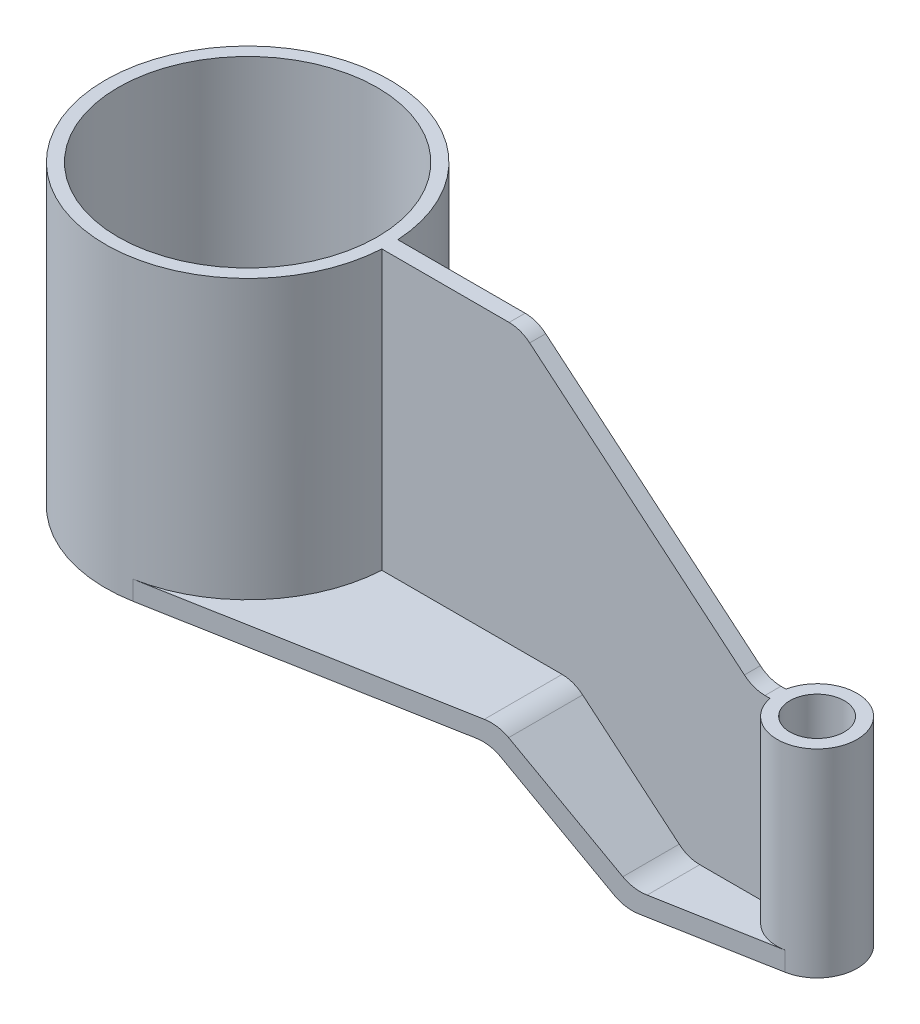
ISO-10303-21;
HEADER;
FILE_DESCRIPTION(('STEP AP214'),'2;1');
FILE_NAME('part.step','',(''),(''),'','','');
FILE_SCHEMA(('AUTOMOTIVE_DESIGN { 1 0 10303 214 1 1 1 1 }'));
ENDSEC;
DATA;
#1=APPLICATION_CONTEXT('core data for automotive mechanical design processes');
#2=APPLICATION_PROTOCOL_DEFINITION('international standard','automotive_design',2000,#1);
#3=PRODUCT_CONTEXT('',#1,'mechanical');
#4=PRODUCT('Part','Part','',(#3));
#5=PRODUCT_RELATED_PRODUCT_CATEGORY('part','',(#4));
#6=PRODUCT_DEFINITION_FORMATION('','',#4);
#7=PRODUCT_DEFINITION_CONTEXT('part definition',#1,'design');
#8=PRODUCT_DEFINITION('design','',#6,#7);
#9=PRODUCT_DEFINITION_SHAPE('','',#8);
#10=(LENGTH_UNIT() NAMED_UNIT(*) SI_UNIT(.MILLI.,.METRE.));
#11=(NAMED_UNIT(*) PLANE_ANGLE_UNIT() SI_UNIT($,.RADIAN.));
#12=(NAMED_UNIT(*) SI_UNIT($,.STERADIAN.) SOLID_ANGLE_UNIT());
#13=UNCERTAINTY_MEASURE_WITH_UNIT(LENGTH_MEASURE(1.E-05),#10,'distance_accuracy_value','');
#14=(GEOMETRIC_REPRESENTATION_CONTEXT(3) GLOBAL_UNCERTAINTY_ASSIGNED_CONTEXT((#13)) GLOBAL_UNIT_ASSIGNED_CONTEXT((#10,
#11,#12)) REPRESENTATION_CONTEXT('',''));
#15=CARTESIAN_POINT('',(0.,0.,0.));
#16=DIRECTION('',(0.,0.,1.));
#17=DIRECTION('',(1.,0.,0.));
#18=AXIS2_PLACEMENT_3D('',#15,#16,#17);
#19=CARTESIAN_POINT('',(-44.5,6.,115.));
#20=DIRECTION('',(0.,-1.,0.));
#21=DIRECTION('',(0.,0.,-1.));
#22=AXIS2_PLACEMENT_3D('',#19,#20,#21);
#23=PLANE('',#22);
#24=DIRECTION('',(-1.,0.,0.));
#25=VECTOR('',#24,1.);
#26=CARTESIAN_POINT('',(-44.5,6.,-2.5));
#27=LINE('',#26,#25);
#28=CARTESIAN_POINT('',(100.791511285108,6.,-2.5));
#29=VERTEX_POINT('',#28);
#30=CARTESIAN_POINT('',(44.4297197830461,6.00000000000001,-2.5));
#31=VERTEX_POINT('',#30);
#32=EDGE_CURVE('E241',#29,#31,#27,.T.);
#33=ORIENTED_EDGE('',*,*,#32,.F.);
#34=DIRECTION('',(0.,0.,-1.));
#35=VECTOR('',#34,1.);
#36=CARTESIAN_POINT('',(100.791511285108,6.,115.));
#37=LINE('',#36,#35);
#38=CARTESIAN_POINT('',(100.791511285108,6.,-26.8170896895578));
#39=VERTEX_POINT('',#38);
#40=EDGE_CURVE('E359',#29,#39,#37,.T.);
#41=ORIENTED_EDGE('',*,*,#40,.T.);
#42=DIRECTION('',(-0.983707704746552,0.,-0.179775280898876));
#43=VECTOR('',#42,1.);
#44=CARTESIAN_POINT('',(-14.7244699243409,6.,-47.927952062633));
#45=LINE('',#44,#43);
#46=CARTESIAN_POINT('',(8.,6.,-43.7749928612216));
#47=VERTEX_POINT('',#46);
#48=EDGE_CURVE('E288',#39,#47,#45,.T.);
#49=ORIENTED_EDGE('',*,*,#48,.T.);
#50=CARTESIAN_POINT('',(0.,6.00000000000001,0.));
#51=DIRECTION('',(0.,-1.,0.));
#52=DIRECTION('',(0.,0.,-1.));
#53=AXIS2_PLACEMENT_3D('',#50,#51,#52);
#54=CIRCLE('',#53,44.5);
#55=EDGE_CURVE('E307',#47,#31,#54,.T.);
#56=ORIENTED_EDGE('',*,*,#55,.T.);
#57=EDGE_LOOP('',(#33,#41,#49,#56));
#58=FACE_BOUND('',#57,.T.);
#59=ADVANCED_FACE('F39',(#58),#23,.F.);
#60=CARTESIAN_POINT('',(190.5,-24.,115.));
#61=DIRECTION('',(0.,-1.,0.));
#62=DIRECTION('',(1.,0.,0.));
#63=AXIS2_PLACEMENT_3D('',#60,#61,#62);
#64=PLANE('',#63);
#65=DIRECTION('',(-0.983707704746552,0.,-0.179775280898876));
#66=VECTOR('',#65,1.);
#67=CARTESIAN_POINT('',(212.680529444426,-24.,-6.36906476098088));
#68=LINE('',#67,#66);
#69=CARTESIAN_POINT('',(180.247191011236,-24.,-12.2963463093319));
#70=VERTEX_POINT('',#69);
#71=CARTESIAN_POINT('',(143.823523748259,-24.,-18.9528713949578));
#72=VERTEX_POINT('',#71);
#73=EDGE_CURVE('E285',#70,#72,#68,.T.);
#74=ORIENTED_EDGE('',*,*,#73,.T.);
#75=DIRECTION('',(0.,0.,-1.));
#76=VECTOR('',#75,1.);
#77=CARTESIAN_POINT('',(143.823523748259,-24.,-2.5));
#78=LINE('',#77,#76);
#79=CARTESIAN_POINT('',(143.823523748259,-24.,-2.5));
#80=VERTEX_POINT('',#79);
#81=EDGE_CURVE('E366',#72,#80,#78,.F.);
#82=ORIENTED_EDGE('',*,*,#81,.T.);
#83=DIRECTION('',(-1.,0.,0.));
#84=VECTOR('',#83,1.);
#85=CARTESIAN_POINT('',(190.5,-24.,-2.5));
#86=LINE('',#85,#84);
#87=CARTESIAN_POINT('',(165.752551286084,-24.,-2.5));
#88=VERTEX_POINT('',#87);
#89=EDGE_CURVE('E230',#88,#80,#86,.T.);
#90=ORIENTED_EDGE('',*,*,#89,.F.);
#91=CARTESIAN_POINT('',(178.,-24.,0.));
#92=DIRECTION('',(0.,-1.,0.));
#93=DIRECTION('',(1.,0.,0.));
#94=AXIS2_PLACEMENT_3D('',#91,#92,#93);
#95=CIRCLE('',#94,12.5);
#96=EDGE_CURVE('E229',#70,#88,#95,.F.);
#97=ORIENTED_EDGE('',*,*,#96,.F.);
#98=EDGE_LOOP('',(#74,#82,#90,#97));
#99=FACE_BOUND('',#98,.T.);
#100=ADVANCED_FACE('F469',(#99),#64,.F.);
#101=CARTESIAN_POINT('',(141.856725658119,-25.4037333412861,115.));
#102=DIRECTION('',(-0.642787609686535,-0.766044443118982,0.));
#103=DIRECTION('',(0.766044443118982,-0.642787609686535,0.));
#104=AXIS2_PLACEMENT_3D('',#101,#102,#103);
#105=PLANE('',#104);
#106=DIRECTION('',(-0.758646133197517,0.636579690560098,-0.138644661458222));
#107=VECTOR('',#106,1.);
#108=CARTESIAN_POINT('',(155.983994696581,-37.2579195810015,-16.7305119785899));
#109=LINE('',#108,#107);
#110=CARTESIAN_POINT('',(137.395647651394,-21.6604444311898,-20.1275833803589));
#111=VERTEX_POINT('',#110);
#112=CARTESIAN_POINT('',(107.219387381974,3.66044443118982,-25.6423777041568));
#113=VERTEX_POINT('',#112);
#114=EDGE_CURVE('E283',#111,#113,#109,.T.);
#115=ORIENTED_EDGE('',*,*,#114,.T.);
#116=DIRECTION('',(0.,0.,-1.));
#117=VECTOR('',#116,1.);
#118=CARTESIAN_POINT('',(107.219387381974,3.66044443118981,115.));
#119=LINE('',#118,#117);
#120=CARTESIAN_POINT('',(107.219387381974,3.66044443118981,-2.5));
#121=VERTEX_POINT('',#120);
#122=EDGE_CURVE('E54',#113,#121,#119,.F.);
#123=ORIENTED_EDGE('',*,*,#122,.T.);
#124=DIRECTION('',(-0.766044443118982,0.642787609686535,0.));
#125=VECTOR('',#124,1.);
#126=CARTESIAN_POINT('',(141.856725658119,-25.4037333412861,-2.5));
#127=LINE('',#126,#125);
#128=CARTESIAN_POINT('',(137.395647651394,-21.6604444311898,-2.5));
#129=VERTEX_POINT('',#128);
#130=EDGE_CURVE('E233',#129,#121,#127,.T.);
#131=ORIENTED_EDGE('',*,*,#130,.F.);
#132=DIRECTION('',(0.,0.,-1.));
#133=VECTOR('',#132,1.);
#134=CARTESIAN_POINT('',(137.395647651394,-21.6604444311898,-19.6180369801038));
#135=LINE('',#134,#133);
#136=EDGE_CURVE('E362',#129,#111,#135,.T.);
#137=ORIENTED_EDGE('',*,*,#136,.T.);
#138=EDGE_LOOP('',(#115,#123,#131,#137));
#139=FACE_BOUND('',#138,.T.);
#140=ADVANCED_FACE('F461',(#139),#105,.F.);
#141=CARTESIAN_POINT('',(0.,93.,0.));
#142=DIRECTION('',(0.,1.,0.));
#143=DIRECTION('',(0.,0.,1.));
#144=AXIS2_PLACEMENT_3D('',#141,#142,#143);
#145=PLANE('',#144);
#146=CARTESIAN_POINT('',(0.,93.,0.));
#147=DIRECTION('',(0.,1.,0.));
#148=DIRECTION('',(0.,0.,1.));
#149=AXIS2_PLACEMENT_3D('',#146,#147,#148);
#150=CIRCLE('',#149,40.5);
#151=CARTESIAN_POINT('',(0.,93.,40.5));
#152=VERTEX_POINT('',#151);
#153=EDGE_CURVE('E322',#152,#152,#150,.T.);
#154=ORIENTED_EDGE('',*,*,#153,.F.);
#155=EDGE_LOOP('',(#154));
#156=FACE_BOUND('',#155,.T.);
#157=DIRECTION('',(1.,0.,0.));
#158=VECTOR('',#157,1.);
#159=CARTESIAN_POINT('',(73.,93.,2.5));
#160=LINE('',#159,#158);
#161=CARTESIAN_POINT('',(84.2294830335946,93.,2.5));
#162=VERTEX_POINT('',#161);
#163=CARTESIAN_POINT('',(44.4297197830461,93.,2.5));
#164=VERTEX_POINT('',#163);
#165=EDGE_CURVE('E231',#162,#164,#160,.F.);
#166=ORIENTED_EDGE('',*,*,#165,.F.);
#167=DIRECTION('',(0.,0.,1.));
#168=VECTOR('',#167,1.);
#169=CARTESIAN_POINT('',(84.2294830335946,93.,0.));
#170=LINE('',#169,#168);
#171=CARTESIAN_POINT('',(84.2294830335946,93.,-2.5));
#172=VERTEX_POINT('',#171);
#173=EDGE_CURVE('E352',#162,#172,#170,.F.);
#174=ORIENTED_EDGE('',*,*,#173,.T.);
#175=DIRECTION('',(1.,0.,0.));
#176=VECTOR('',#175,1.);
#177=CARTESIAN_POINT('',(73.,93.,-2.5));
#178=LINE('',#177,#176);
#179=CARTESIAN_POINT('',(44.4297197830461,93.,-2.5));
#180=VERTEX_POINT('',#179);
#181=EDGE_CURVE('E238',#172,#180,#178,.F.);
#182=ORIENTED_EDGE('',*,*,#181,.T.);
#183=CARTESIAN_POINT('',(0.,93.,0.));
#184=DIRECTION('',(0.,1.,0.));
#185=DIRECTION('',(0.,0.,1.));
#186=AXIS2_PLACEMENT_3D('',#183,#184,#185);
#187=CIRCLE('',#186,44.5);
#188=EDGE_CURVE('E213',#180,#164,#187,.T.);
#189=ORIENTED_EDGE('',*,*,#188,.T.);
#190=EDGE_LOOP('',(#166,#174,#182,#189));
#191=FACE_BOUND('',#190,.T.);
#192=ADVANCED_FACE('F453',(#156,#191),#145,.T.);
#193=DIRECTION('',(-0.983707704746552,0.,0.179775280898876));
#194=VECTOR('',#193,1.);
#195=CARTESIAN_POINT('',(-55.399125581277,6.,55.361356935755));
#196=LINE('',#195,#194);
#197=CARTESIAN_POINT('',(100.791511285108,6.,26.8170896895578));
#198=VERTEX_POINT('',#197);
#199=CARTESIAN_POINT('',(8.,6.,43.7749928612216));
#200=VERTEX_POINT('',#199);
#201=EDGE_CURVE('E302',#198,#200,#196,.T.);
#202=ORIENTED_EDGE('',*,*,#201,.F.);
#203=DIRECTION('',(0.,0.,-1.));
#204=VECTOR('',#203,1.);
#205=CARTESIAN_POINT('',(100.791511285108,6.,115.));
#206=LINE('',#205,#204);
#207=CARTESIAN_POINT('',(100.791511285108,6.,2.5));
#208=VERTEX_POINT('',#207);
#209=EDGE_CURVE('E375',#198,#208,#206,.T.);
#210=ORIENTED_EDGE('',*,*,#209,.T.);
#211=DIRECTION('',(-1.,0.,0.));
#212=VECTOR('',#211,1.);
#213=CARTESIAN_POINT('',(-44.5,6.,2.5));
#214=LINE('',#213,#212);
#215=CARTESIAN_POINT('',(44.4297197830461,6.00000000000001,2.5));
#216=VERTEX_POINT('',#215);
#217=EDGE_CURVE('E254',#208,#216,#214,.T.);
#218=ORIENTED_EDGE('',*,*,#217,.T.);
#219=EDGE_CURVE('E306',#216,#200,#54,.T.);
#220=ORIENTED_EDGE('',*,*,#219,.T.);
#221=EDGE_LOOP('',(#202,#210,#218,#220));
#222=FACE_BOUND('',#221,.T.);
#223=ADVANCED_FACE('F445',(#222),#23,.F.);
#224=DIRECTION('',(-1.,0.,0.));
#225=VECTOR('',#224,1.);
#226=CARTESIAN_POINT('',(190.5,-24.,2.5));
#227=LINE('',#226,#225);
#228=CARTESIAN_POINT('',(165.752551286084,-24.,2.5));
#229=VERTEX_POINT('',#228);
#230=CARTESIAN_POINT('',(143.823523748259,-24.,2.5));
#231=VERTEX_POINT('',#230);
#232=EDGE_CURVE('E248',#229,#231,#227,.T.);
#233=ORIENTED_EDGE('',*,*,#232,.T.);
#234=DIRECTION('',(0.,0.,-1.));
#235=VECTOR('',#234,1.);
#236=CARTESIAN_POINT('',(143.823523748259,-24.,19.6180369801038));
#237=LINE('',#236,#235);
#238=CARTESIAN_POINT('',(143.823523748259,-24.,18.9528713949578));
#239=VERTEX_POINT('',#238);
#240=EDGE_CURVE('E373',#231,#239,#237,.F.);
#241=ORIENTED_EDGE('',*,*,#240,.T.);
#242=DIRECTION('',(-0.983707704746552,0.,0.179775280898876));
#243=VECTOR('',#242,1.);
#244=CARTESIAN_POINT('',(172.00587378749,-24.,13.8024696341029));
#245=LINE('',#244,#243);
#246=CARTESIAN_POINT('',(180.247191011236,-24.,12.2963463093319));
#247=VERTEX_POINT('',#246);
#248=EDGE_CURVE('E299',#247,#239,#245,.T.);
#249=ORIENTED_EDGE('',*,*,#248,.F.);
#250=EDGE_CURVE('E310',#229,#247,#95,.F.);
#251=ORIENTED_EDGE('',*,*,#250,.F.);
#252=EDGE_LOOP('',(#233,#241,#249,#251));
#253=FACE_BOUND('',#252,.T.);
#254=ADVANCED_FACE('F408',(#253),#64,.F.);
#255=DIRECTION('',(-0.758646133197517,0.636579690560098,0.138644661458222));
#256=VECTOR('',#255,1.);
#257=CARTESIAN_POINT('',(131.792080346716,-16.9584931725581,21.1516506732888));
#258=LINE('',#257,#256);
#259=CARTESIAN_POINT('',(137.395647651394,-21.6604444311898,20.1275833803588));
#260=VERTEX_POINT('',#259);
#261=CARTESIAN_POINT('',(107.219387381974,3.66044443118982,25.6423777041568));
#262=VERTEX_POINT('',#261);
#263=EDGE_CURVE('E296',#260,#262,#258,.T.);
#264=ORIENTED_EDGE('',*,*,#263,.F.);
#265=DIRECTION('',(0.,0.,-1.));
#266=VECTOR('',#265,1.);
#267=CARTESIAN_POINT('',(137.395647651394,-21.6604444311898,2.5));
#268=LINE('',#267,#266);
#269=CARTESIAN_POINT('',(137.395647651394,-21.6604444311898,2.5));
#270=VERTEX_POINT('',#269);
#271=EDGE_CURVE('E370',#260,#270,#268,.T.);
#272=ORIENTED_EDGE('',*,*,#271,.T.);
#273=DIRECTION('',(-0.766044443118982,0.642787609686535,0.));
#274=VECTOR('',#273,1.);
#275=CARTESIAN_POINT('',(141.856725658119,-25.4037333412861,2.5));
#276=LINE('',#275,#274);
#277=CARTESIAN_POINT('',(107.219387381974,3.66044443118981,2.5));
#278=VERTEX_POINT('',#277);
#279=EDGE_CURVE('E251',#270,#278,#276,.T.);
#280=ORIENTED_EDGE('',*,*,#279,.T.);
#281=DIRECTION('',(0.,0.,-1.));
#282=VECTOR('',#281,1.);
#283=CARTESIAN_POINT('',(107.219387381974,3.66044443118981,115.));
#284=LINE('',#283,#282);
#285=EDGE_CURVE('E368',#278,#262,#284,.F.);
#286=ORIENTED_EDGE('',*,*,#285,.T.);
#287=EDGE_LOOP('',(#264,#272,#280,#286));
#288=FACE_BOUND('',#287,.T.);
#289=ADVANCED_FACE('F399',(#288),#105,.F.);
#290=CARTESIAN_POINT('',(0.,93.,0.));
#291=DIRECTION('',(0.,-1.,0.));
#292=DIRECTION('',(0.,0.,-1.));
#293=AXIS2_PLACEMENT_3D('',#290,#291,#292);
#294=CYLINDRICAL_SURFACE('',#293,44.5);
#295=DIRECTION('',(0.,-1.,0.));
#296=VECTOR('',#295,1.);
#297=CARTESIAN_POINT('',(44.4297197830461,93.,2.5));
#298=LINE('',#297,#296);
#299=EDGE_CURVE('E256',#216,#164,#298,.F.);
#300=ORIENTED_EDGE('',*,*,#299,.T.);
#301=ORIENTED_EDGE('',*,*,#188,.F.);
#302=DIRECTION('',(0.,-1.,0.));
#303=VECTOR('',#302,1.);
#304=CARTESIAN_POINT('',(44.4297197830461,93.,-2.5));
#305=LINE('',#304,#303);
#306=EDGE_CURVE('E243',#31,#180,#305,.F.);
#307=ORIENTED_EDGE('',*,*,#306,.F.);
#308=ORIENTED_EDGE('',*,*,#55,.F.);
#309=DIRECTION('',(0.,1.,0.));
#310=VECTOR('',#309,1.);
#311=CARTESIAN_POINT('',(8.,-30.,-43.7749928612216));
#312=LINE('',#311,#310);
#313=CARTESIAN_POINT('',(8.,0.,-43.7749928612216));
#314=VERTEX_POINT('',#313);
#315=EDGE_CURVE('E274',#314,#47,#312,.T.);
#316=ORIENTED_EDGE('',*,*,#315,.F.);
#317=CARTESIAN_POINT('',(0.,0.,0.));
#318=DIRECTION('',(0.,1.,0.));
#319=DIRECTION('',(0.,0.,1.));
#320=AXIS2_PLACEMENT_3D('',#317,#318,#319);
#321=CIRCLE('',#320,44.5);
#322=CARTESIAN_POINT('',(8.,0.,43.7749928612216));
#323=VERTEX_POINT('',#322);
#324=EDGE_CURVE('E315',#314,#323,#321,.T.);
#325=ORIENTED_EDGE('',*,*,#324,.T.);
#326=DIRECTION('',(0.,1.,0.));
#327=VECTOR('',#326,1.);
#328=CARTESIAN_POINT('',(8.,-30.,43.7749928612216));
#329=LINE('',#328,#327);
#330=EDGE_CURVE('E271',#323,#200,#329,.T.);
#331=ORIENTED_EDGE('',*,*,#330,.T.);
#332=ORIENTED_EDGE('',*,*,#219,.F.);
#333=EDGE_LOOP('',(#300,#301,#307,#308,#316,#325,#331,#332));
#334=FACE_BOUND('',#333,.T.);
#335=ADVANCED_FACE('F438',(#334),#294,.T.);
#336=CARTESIAN_POINT('',(178.,32.,0.));
#337=DIRECTION('',(0.,-1.,0.));
#338=DIRECTION('',(0.,0.,-1.));
#339=AXIS2_PLACEMENT_3D('',#336,#337,#338);
#340=CYLINDRICAL_SURFACE('',#339,12.5);
#341=CARTESIAN_POINT('',(178.,32.,0.));
#342=DIRECTION('',(0.,1.,0.));
#343=DIRECTION('',(0.,0.,1.));
#344=AXIS2_PLACEMENT_3D('',#341,#342,#343);
#345=CIRCLE('',#344,12.5);
#346=CARTESIAN_POINT('',(165.752551286084,32.,2.5));
#347=VERTEX_POINT('',#346);
#348=CARTESIAN_POINT('',(165.752551286084,32.,-2.5));
#349=VERTEX_POINT('',#348);
#350=EDGE_CURVE('E201',#347,#349,#345,.T.);
#351=ORIENTED_EDGE('',*,*,#350,.F.);
#352=DIRECTION('',(0.,-1.,0.));
#353=VECTOR('',#352,1.);
#354=CARTESIAN_POINT('',(165.752551286084,32.,2.5));
#355=LINE('',#354,#353);
#356=EDGE_CURVE('E246',#347,#229,#355,.T.);
#357=ORIENTED_EDGE('',*,*,#356,.T.);
#358=ORIENTED_EDGE('',*,*,#250,.T.);
#359=DIRECTION('',(0.,1.,0.));
#360=VECTOR('',#359,1.);
#361=CARTESIAN_POINT('',(180.247191011236,-30.,12.2963463093319));
#362=LINE('',#361,#360);
#363=CARTESIAN_POINT('',(180.247191011236,-30.,12.2963463093319));
#364=VERTEX_POINT('',#363);
#365=EDGE_CURVE('E267',#364,#247,#362,.T.);
#366=ORIENTED_EDGE('',*,*,#365,.F.);
#367=CARTESIAN_POINT('',(178.,-30.,0.));
#368=DIRECTION('',(0.,1.,0.));
#369=DIRECTION('',(0.,0.,1.));
#370=AXIS2_PLACEMENT_3D('',#367,#368,#369);
#371=CIRCLE('',#370,12.5);
#372=CARTESIAN_POINT('',(180.247191011236,-30.,-12.2963463093319));
#373=VERTEX_POINT('',#372);
#374=EDGE_CURVE('E259',#364,#373,#371,.T.);
#375=ORIENTED_EDGE('',*,*,#374,.T.);
#376=DIRECTION('',(0.,1.,0.));
#377=VECTOR('',#376,1.);
#378=CARTESIAN_POINT('',(180.247191011236,-30.,-12.2963463093319));
#379=LINE('',#378,#377);
#380=EDGE_CURVE('E266',#373,#70,#379,.T.);
#381=ORIENTED_EDGE('',*,*,#380,.T.);
#382=ORIENTED_EDGE('',*,*,#96,.T.);
#383=DIRECTION('',(0.,-1.,0.));
#384=VECTOR('',#383,1.);
#385=CARTESIAN_POINT('',(165.752551286084,32.,-2.5));
#386=LINE('',#385,#384);
#387=EDGE_CURVE('E218',#349,#88,#386,.T.);
#388=ORIENTED_EDGE('',*,*,#387,.F.);
#389=EDGE_LOOP('',(#351,#357,#358,#366,#375,#381,#382,#388));
#390=FACE_BOUND('',#389,.T.);
#391=ADVANCED_FACE('F226',(#390),#340,.T.);
#392=CARTESIAN_POINT('',(178.,32.,0.));
#393=DIRECTION('',(0.,1.,0.));
#394=DIRECTION('',(0.,0.,1.));
#395=AXIS2_PLACEMENT_3D('',#392,#393,#394);
#396=PLANE('',#395);
#397=CARTESIAN_POINT('',(178.,32.,0.));
#398=DIRECTION('',(0.,1.,0.));
#399=DIRECTION('',(0.,0.,1.));
#400=AXIS2_PLACEMENT_3D('',#397,#398,#399);
#401=CIRCLE('',#400,8.50000000000001);
#402=CARTESIAN_POINT('',(178.,32.,8.50000000000001));
#403=VERTEX_POINT('',#402);
#404=EDGE_CURVE('E312',#403,#403,#401,.T.);
#405=ORIENTED_EDGE('',*,*,#404,.F.);
#406=EDGE_LOOP('',(#405));
#407=FACE_BOUND('',#406,.T.);
#408=DIRECTION('',(1.,0.,0.));
#409=VECTOR('',#408,1.);
#410=CARTESIAN_POINT('',(73.,32.,-2.5));
#411=LINE('',#410,#409);
#412=CARTESIAN_POINT('',(164.205856867166,32.,-2.5));
#413=VERTEX_POINT('',#412);
#414=EDGE_CURVE('E205',#349,#413,#411,.F.);
#415=ORIENTED_EDGE('',*,*,#414,.T.);
#416=DIRECTION('',(0.,0.,1.));
#417=VECTOR('',#416,1.);
#418=CARTESIAN_POINT('',(164.205856867166,32.,2.5));
#419=LINE('',#418,#417);
#420=CARTESIAN_POINT('',(164.205856867166,32.,2.5));
#421=VERTEX_POINT('',#420);
#422=EDGE_CURVE('E357',#413,#421,#419,.T.);
#423=ORIENTED_EDGE('',*,*,#422,.T.);
#424=DIRECTION('',(1.,0.,0.));
#425=VECTOR('',#424,1.);
#426=CARTESIAN_POINT('',(73.,32.,2.5));
#427=LINE('',#426,#425);
#428=EDGE_CURVE('E208',#347,#421,#427,.F.);
#429=ORIENTED_EDGE('',*,*,#428,.F.);
#430=ORIENTED_EDGE('',*,*,#350,.T.);
#431=EDGE_LOOP('',(#415,#423,#429,#430));
#432=FACE_BOUND('',#431,.T.);
#433=ADVANCED_FACE('F203',(#407,#432),#396,.T.);
#434=CARTESIAN_POINT('',(178.,-30.,0.));
#435=DIRECTION('',(0.,1.,0.));
#436=DIRECTION('',(0.,0.,1.));
#437=AXIS2_PLACEMENT_3D('',#434,#435,#436);
#438=CYLINDRICAL_SURFACE('',#437,8.50000000000001);
#439=CARTESIAN_POINT('',(178.,-30.,0.));
#440=DIRECTION('',(0.,-1.,0.));
#441=DIRECTION('',(1.,0.,0.));
#442=AXIS2_PLACEMENT_3D('',#439,#440,#441);
#443=CIRCLE('',#442,8.50000000000001);
#444=CARTESIAN_POINT('',(186.5,-30.,0.));
#445=VERTEX_POINT('',#444);
#446=EDGE_CURVE('E317',#445,#445,#443,.T.);
#447=ORIENTED_EDGE('',*,*,#446,.T.);
#448=EDGE_LOOP('',(#447));
#449=FACE_BOUND('',#448,.T.);
#450=ORIENTED_EDGE('',*,*,#404,.T.);
#451=EDGE_LOOP('',(#450));
#452=FACE_BOUND('',#451,.T.);
#453=ADVANCED_FACE('F493',(#449,#452),#438,.F.);
#454=CARTESIAN_POINT('',(0.,0.,0.));
#455=DIRECTION('',(0.,1.,0.));
#456=DIRECTION('',(0.,0.,1.));
#457=AXIS2_PLACEMENT_3D('',#454,#455,#456);
#458=PLANE('',#457);
#459=CARTESIAN_POINT('',(0.,0.,0.));
#460=DIRECTION('',(0.,1.,0.));
#461=DIRECTION('',(0.,0.,1.));
#462=AXIS2_PLACEMENT_3D('',#459,#460,#461);
#463=CIRCLE('',#462,40.5);
#464=CARTESIAN_POINT('',(0.,0.,40.5));
#465=VERTEX_POINT('',#464);
#466=EDGE_CURVE('E214',#465,#465,#463,.T.);
#467=ORIENTED_EDGE('',*,*,#466,.T.);
#468=EDGE_LOOP('',(#467));
#469=FACE_BOUND('',#468,.T.);
#470=DIRECTION('',(0.983707704746552,0.,0.179775280898876));
#471=VECTOR('',#470,1.);
#472=CARTESIAN_POINT('',(8.00000000000001,0.,-43.7749928612216));
#473=LINE('',#472,#471);
#474=CARTESIAN_POINT('',(98.6076898795113,0.,-27.2161890406454));
#475=VERTEX_POINT('',#474);
#476=EDGE_CURVE('E270',#314,#475,#473,.T.);
#477=ORIENTED_EDGE('',*,*,#476,.T.);
#478=DIRECTION('',(0.,0.,-1.));
#479=VECTOR('',#478,1.);
#480=CARTESIAN_POINT('',(98.6076898795113,0.,0.));
#481=LINE('',#480,#479);
#482=CARTESIAN_POINT('',(98.6076898795113,0.,27.2161890406454));
#483=VERTEX_POINT('',#482);
#484=EDGE_CURVE('E341',#475,#483,#481,.F.);
#485=ORIENTED_EDGE('',*,*,#484,.T.);
#486=DIRECTION('',(0.983707704746552,0.,-0.179775280898876));
#487=VECTOR('',#486,1.);
#488=CARTESIAN_POINT('',(8.00000000000001,0.,43.7749928612216));
#489=LINE('',#488,#487);
#490=EDGE_CURVE('E290',#323,#483,#489,.T.);
#491=ORIENTED_EDGE('',*,*,#490,.F.);
#492=ORIENTED_EDGE('',*,*,#324,.F.);
#493=EDGE_LOOP('',(#477,#485,#491,#492));
#494=FACE_BOUND('',#493,.T.);
#495=ADVANCED_FACE('F434',(#469,#494),#458,.F.);
#496=CARTESIAN_POINT('',(190.5,-30.,115.));
#497=DIRECTION('',(0.,-1.,0.));
#498=DIRECTION('',(1.,0.,0.));
#499=AXIS2_PLACEMENT_3D('',#496,#497,#498);
#500=PLANE('',#499);
#501=ORIENTED_EDGE('',*,*,#446,.F.);
#502=EDGE_LOOP('',(#501));
#503=FACE_BOUND('',#502,.T.);
#504=DIRECTION('',(0.983707704746552,0.,-0.179775280898877));
#505=VECTOR('',#504,1.);
#506=CARTESIAN_POINT('',(8.00000000000001,-30.,43.7749928612216));
#507=LINE('',#506,#505);
#508=CARTESIAN_POINT('',(141.639702342662,-30.,19.3519707460453));
#509=VERTEX_POINT('',#508);
#510=EDGE_CURVE('E264',#509,#364,#507,.T.);
#511=ORIENTED_EDGE('',*,*,#510,.F.);
#512=DIRECTION('',(0.,0.,-1.));
#513=VECTOR('',#512,1.);
#514=CARTESIAN_POINT('',(141.639702342662,-30.,115.));
#515=LINE('',#514,#513);
#516=CARTESIAN_POINT('',(141.639702342662,-30.,-19.3519707460453));
#517=VERTEX_POINT('',#516);
#518=EDGE_CURVE('E325',#509,#517,#515,.T.);
#519=ORIENTED_EDGE('',*,*,#518,.T.);
#520=DIRECTION('',(0.983707704746552,0.,0.179775280898877));
#521=VECTOR('',#520,1.);
#522=CARTESIAN_POINT('',(8.00000000000001,-30.,-43.7749928612216));
#523=LINE('',#522,#521);
#524=EDGE_CURVE('E262',#517,#373,#523,.T.);
#525=ORIENTED_EDGE('',*,*,#524,.T.);
#526=ORIENTED_EDGE('',*,*,#374,.F.);
#527=EDGE_LOOP('',(#511,#519,#525,#526));
#528=FACE_BOUND('',#527,.T.);
#529=ADVANCED_FACE('F415',(#503,#528),#500,.T.);
#530=CARTESIAN_POINT('',(138.,-30.,115.));
#531=DIRECTION('',(-0.642787609686535,-0.766044443118982,0.));
#532=DIRECTION('',(0.766044443118982,-0.642787609686535,0.));
#533=AXIS2_PLACEMENT_3D('',#530,#531,#532);
#534=PLANE('',#533);
#535=DIRECTION('',(-0.758646133197517,0.636579690560098,-0.138644661458222));
#536=VECTOR('',#535,1.);
#537=CARTESIAN_POINT('',(152.201404338644,-41.9163931427556,-17.4217907404032));
#538=LINE('',#537,#536);
#539=CARTESIAN_POINT('',(135.211826245797,-27.6604444311898,-20.5266827314464));
#540=VERTEX_POINT('',#539);
#541=CARTESIAN_POINT('',(105.035565976377,-2.33955556881018,-26.0414770552444));
#542=VERTEX_POINT('',#541);
#543=EDGE_CURVE('E280',#540,#542,#538,.T.);
#544=ORIENTED_EDGE('',*,*,#543,.F.);
#545=DIRECTION('',(0.,0.,-1.));
#546=VECTOR('',#545,1.);
#547=CARTESIAN_POINT('',(135.211826245797,-27.6604444311898,115.));
#548=LINE('',#547,#546);
#549=CARTESIAN_POINT('',(135.211826245797,-27.6604444311898,20.5266827314464));
#550=VERTEX_POINT('',#549);
#551=EDGE_CURVE('E335',#540,#550,#548,.F.);
#552=ORIENTED_EDGE('',*,*,#551,.T.);
#553=DIRECTION('',(-0.758646133197517,0.636579690560098,0.138644661458222));
#554=VECTOR('',#553,1.);
#555=CARTESIAN_POINT('',(128.00948998878,-21.6169667343122,21.8429294351021));
#556=LINE('',#555,#554);
#557=CARTESIAN_POINT('',(105.035565976377,-2.33955556881019,26.0414770552444));
#558=VERTEX_POINT('',#557);
#559=EDGE_CURVE('E293',#550,#558,#556,.T.);
#560=ORIENTED_EDGE('',*,*,#559,.T.);
#561=DIRECTION('',(0.,0.,-1.));
#562=VECTOR('',#561,1.);
#563=CARTESIAN_POINT('',(105.035565976377,-2.33955556881019,115.));
#564=LINE('',#563,#562);
#565=EDGE_CURVE('E332',#558,#542,#564,.T.);
#566=ORIENTED_EDGE('',*,*,#565,.T.);
#567=EDGE_LOOP('',(#544,#552,#560,#566));
#568=FACE_BOUND('',#567,.T.);
#569=ADVANCED_FACE('F425',(#568),#534,.T.);
#570=CARTESIAN_POINT('',(8.00000000000001,-30.,-43.7749928612216));
#571=DIRECTION('',(-0.179775280898876,0.,0.983707704746552));
#572=DIRECTION('',(0.983707704746552,0.,0.179775280898876));
#573=AXIS2_PLACEMENT_3D('',#570,#571,#572);
#574=PLANE('',#573);
#575=ORIENTED_EDGE('',*,*,#524,.F.);
#576=CARTESIAN_POINT('',(141.639702342662,-20.,-19.3519707460454));
#577=DIRECTION('',(-0.179775280898876,0.,0.983707704746552));
#578=DIRECTION('',(-0.983707704746552,0.,-0.179775280898876));
#579=AXIS2_PLACEMENT_3D('',#576,#577,#578);
#580=ELLIPSE('',#579,10.1656213037149,10.);
#581=EDGE_CURVE('E330',#517,#540,#580,.F.);
#582=ORIENTED_EDGE('',*,*,#581,.T.);
#583=ORIENTED_EDGE('',*,*,#543,.T.);
#584=CARTESIAN_POINT('',(98.6076898795113,-10.,-27.2161890406454));
#585=DIRECTION('',(-0.179775280898876,0.,0.983707704746552));
#586=DIRECTION('',(-0.983707704746552,0.,-0.179775280898876));
#587=AXIS2_PLACEMENT_3D('',#584,#585,#586);
#588=ELLIPSE('',#587,10.1656213037149,10.);
#589=EDGE_CURVE('E378',#542,#475,#588,.T.);
#590=ORIENTED_EDGE('',*,*,#589,.T.);
#591=ORIENTED_EDGE('',*,*,#476,.F.);
#592=ORIENTED_EDGE('',*,*,#315,.T.);
#593=ORIENTED_EDGE('',*,*,#48,.F.);
#594=CARTESIAN_POINT('',(100.791511285108,-4.,-26.8170896895578));
#595=DIRECTION('',(-0.179775280898876,0.,0.983707704746552));
#596=DIRECTION('',(-0.983707704746552,0.,-0.179775280898876));
#597=AXIS2_PLACEMENT_3D('',#594,#595,#596);
#598=ELLIPSE('',#597,10.1656213037149,10.);
#599=EDGE_CURVE('E328',#39,#113,#598,.F.);
#600=ORIENTED_EDGE('',*,*,#599,.T.);
#601=ORIENTED_EDGE('',*,*,#114,.F.);
#602=CARTESIAN_POINT('',(143.823523748259,-14.,-18.9528713949578));
#603=DIRECTION('',(-0.179775280898876,0.,0.983707704746552));
#604=DIRECTION('',(0.983707704746552,0.,0.179775280898876));
#605=AXIS2_PLACEMENT_3D('',#602,#603,#604);
#606=ELLIPSE('',#605,10.1656213037149,10.);
#607=EDGE_CURVE('E387',#111,#72,#606,.T.);
#608=ORIENTED_EDGE('',*,*,#607,.T.);
#609=ORIENTED_EDGE('',*,*,#73,.F.);
#610=ORIENTED_EDGE('',*,*,#380,.F.);
#611=EDGE_LOOP('',(#575,#582,#583,#590,#591,#592,#593,#600,#601,#608,#609,#610));
#612=FACE_BOUND('',#611,.T.);
#613=ADVANCED_FACE('F422',(#612),#574,.F.);
#614=CARTESIAN_POINT('',(8.00000000000001,-30.,43.7749928612216));
#615=DIRECTION('',(0.179775280898876,0.,0.983707704746552));
#616=DIRECTION('',(0.983707704746552,0.,-0.179775280898876));
#617=AXIS2_PLACEMENT_3D('',#614,#615,#616);
#618=PLANE('',#617);
#619=ORIENTED_EDGE('',*,*,#559,.F.);
#620=CARTESIAN_POINT('',(141.639702342662,-20.,19.3519707460454));
#621=DIRECTION('',(0.179775280898876,0.,0.983707704746552));
#622=DIRECTION('',(0.983707704746552,0.,-0.179775280898876));
#623=AXIS2_PLACEMENT_3D('',#620,#621,#622);
#624=ELLIPSE('',#623,10.1656213037149,10.);
#625=EDGE_CURVE('E339',#550,#509,#624,.T.);
#626=ORIENTED_EDGE('',*,*,#625,.T.);
#627=ORIENTED_EDGE('',*,*,#510,.T.);
#628=ORIENTED_EDGE('',*,*,#365,.T.);
#629=ORIENTED_EDGE('',*,*,#248,.T.);
#630=CARTESIAN_POINT('',(143.823523748259,-14.,18.9528713949578));
#631=DIRECTION('',(0.179775280898876,0.,0.983707704746552));
#632=DIRECTION('',(-0.983707704746552,0.,0.179775280898876));
#633=AXIS2_PLACEMENT_3D('',#630,#631,#632);
#634=ELLIPSE('',#633,10.1656213037149,10.);
#635=EDGE_CURVE('E47',#239,#260,#634,.F.);
#636=ORIENTED_EDGE('',*,*,#635,.T.);
#637=ORIENTED_EDGE('',*,*,#263,.T.);
#638=CARTESIAN_POINT('',(100.791511285108,-4.,26.8170896895578));
#639=DIRECTION('',(0.179775280898876,0.,0.983707704746552));
#640=DIRECTION('',(0.983707704746552,0.,-0.179775280898876));
#641=AXIS2_PLACEMENT_3D('',#638,#639,#640);
#642=ELLIPSE('',#641,10.1656213037149,10.);
#643=EDGE_CURVE('E337',#262,#198,#642,.T.);
#644=ORIENTED_EDGE('',*,*,#643,.T.);
#645=ORIENTED_EDGE('',*,*,#201,.T.);
#646=ORIENTED_EDGE('',*,*,#330,.F.);
#647=ORIENTED_EDGE('',*,*,#490,.T.);
#648=CARTESIAN_POINT('',(98.6076898795113,-10.,27.2161890406454));
#649=DIRECTION('',(0.179775280898876,0.,0.983707704746552));
#650=DIRECTION('',(0.983707704746552,0.,-0.179775280898876));
#651=AXIS2_PLACEMENT_3D('',#648,#649,#650);
#652=ELLIPSE('',#651,10.1656213037149,10.);
#653=EDGE_CURVE('E380',#483,#558,#652,.F.);
#654=ORIENTED_EDGE('',*,*,#653,.T.);
#655=EDGE_LOOP('',(#619,#626,#627,#628,#629,#636,#637,#644,#645,#646,#647,#654));
#656=FACE_BOUND('',#655,.T.);
#657=ADVANCED_FACE('F392',(#656),#618,.T.);
#658=CARTESIAN_POINT('',(0.,-30.,0.));
#659=DIRECTION('',(0.,1.,0.));
#660=DIRECTION('',(0.,0.,1.));
#661=AXIS2_PLACEMENT_3D('',#658,#659,#660);
#662=CYLINDRICAL_SURFACE('',#661,40.5);
#663=ORIENTED_EDGE('',*,*,#466,.F.);
#664=EDGE_LOOP('',(#663));
#665=FACE_BOUND('',#664,.T.);
#666=ORIENTED_EDGE('',*,*,#153,.T.);
#667=EDGE_LOOP('',(#666));
#668=FACE_BOUND('',#667,.T.);
#669=ADVANCED_FACE('F586',(#665,#668),#662,.F.);
#670=CARTESIAN_POINT('',(73.,31.5,2.5));
#671=DIRECTION('',(0.,0.,1.));
#672=DIRECTION('',(1.,0.,0.));
#673=AXIS2_PLACEMENT_3D('',#670,#671,#672);
#674=PLANE('',#673);
#675=DIRECTION('',(-0.766044443118983,0.642787609686534,0.));
#676=VECTOR('',#675,1.);
#677=CARTESIAN_POINT('',(87.8691853762565,93.,2.5));
#678=LINE('',#677,#676);
#679=CARTESIAN_POINT('',(157.777980770301,34.3395555688102,2.5));
#680=VERTEX_POINT('',#679);
#681=CARTESIAN_POINT('',(90.6573591304599,90.6604444311898,2.5));
#682=VERTEX_POINT('',#681);
#683=EDGE_CURVE('E235',#680,#682,#678,.T.);
#684=ORIENTED_EDGE('',*,*,#683,.T.);
#685=CARTESIAN_POINT('',(84.2294830335946,83.,2.5));
#686=DIRECTION('',(0.,0.,1.));
#687=DIRECTION('',(1.,0.,0.));
#688=AXIS2_PLACEMENT_3D('',#685,#686,#687);
#689=CIRCLE('',#688,10.);
#690=EDGE_CURVE('E350',#682,#162,#689,.T.);
#691=ORIENTED_EDGE('',*,*,#690,.T.);
#692=ORIENTED_EDGE('',*,*,#165,.T.);
#693=ORIENTED_EDGE('',*,*,#299,.F.);
#694=ORIENTED_EDGE('',*,*,#217,.F.);
#695=CARTESIAN_POINT('',(100.791511285108,-4.,2.5));
#696=DIRECTION('',(0.,0.,1.));
#697=DIRECTION('',(1.,0.,0.));
#698=AXIS2_PLACEMENT_3D('',#695,#696,#697);
#699=CIRCLE('',#698,10.);
#700=EDGE_CURVE('E11',#208,#278,#699,.F.);
#701=ORIENTED_EDGE('',*,*,#700,.T.);
#702=ORIENTED_EDGE('',*,*,#279,.F.);
#703=CARTESIAN_POINT('',(143.823523748259,-14.,2.5));
#704=DIRECTION('',(0.,0.,1.));
#705=DIRECTION('',(1.,0.,0.));
#706=AXIS2_PLACEMENT_3D('',#703,#704,#705);
#707=CIRCLE('',#706,10.);
#708=EDGE_CURVE('E348',#270,#231,#707,.T.);
#709=ORIENTED_EDGE('',*,*,#708,.T.);
#710=ORIENTED_EDGE('',*,*,#232,.F.);
#711=ORIENTED_EDGE('',*,*,#356,.F.);
#712=ORIENTED_EDGE('',*,*,#428,.T.);
#713=CARTESIAN_POINT('',(164.205856867166,42.,2.5));
#714=DIRECTION('',(0.,0.,1.));
#715=DIRECTION('',(1.,0.,0.));
#716=AXIS2_PLACEMENT_3D('',#713,#714,#715);
#717=CIRCLE('',#716,10.);
#718=EDGE_CURVE('E382',#421,#680,#717,.F.);
#719=ORIENTED_EDGE('',*,*,#718,.T.);
#720=EDGE_LOOP('',(#684,#691,#692,#693,#694,#701,#702,#709,#710,#711,#712,#719));
#721=FACE_BOUND('',#720,.T.);
#722=ADVANCED_FACE('F405',(#721),#674,.T.);
#723=CARTESIAN_POINT('',(73.,31.5,-2.5));
#724=DIRECTION('',(0.,0.,1.));
#725=DIRECTION('',(1.,0.,0.));
#726=AXIS2_PLACEMENT_3D('',#723,#724,#725);
#727=PLANE('',#726);
#728=ORIENTED_EDGE('',*,*,#181,.F.);
#729=CARTESIAN_POINT('',(84.2294830335946,83.,-2.5));
#730=DIRECTION('',(0.,0.,1.));
#731=DIRECTION('',(1.,0.,0.));
#732=AXIS2_PLACEMENT_3D('',#729,#730,#731);
#733=CIRCLE('',#732,10.);
#734=CARTESIAN_POINT('',(90.6573591304599,90.6604444311898,-2.5));
#735=VERTEX_POINT('',#734);
#736=EDGE_CURVE('E355',#172,#735,#733,.F.);
#737=ORIENTED_EDGE('',*,*,#736,.T.);
#738=DIRECTION('',(-0.766044443118983,0.642787609686534,0.));
#739=VECTOR('',#738,1.);
#740=CARTESIAN_POINT('',(87.8691853762565,93.,-2.5));
#741=LINE('',#740,#739);
#742=CARTESIAN_POINT('',(157.777980770301,34.3395555688102,-2.5));
#743=VERTEX_POINT('',#742);
#744=EDGE_CURVE('E223',#743,#735,#741,.T.);
#745=ORIENTED_EDGE('',*,*,#744,.F.);
#746=CARTESIAN_POINT('',(164.205856867166,42.,-2.5));
#747=DIRECTION('',(0.,0.,1.));
#748=DIRECTION('',(1.,0.,0.));
#749=AXIS2_PLACEMENT_3D('',#746,#747,#748);
#750=CIRCLE('',#749,10.);
#751=EDGE_CURVE('E222',#743,#413,#750,.T.);
#752=ORIENTED_EDGE('',*,*,#751,.T.);
#753=ORIENTED_EDGE('',*,*,#414,.F.);
#754=ORIENTED_EDGE('',*,*,#387,.T.);
#755=ORIENTED_EDGE('',*,*,#89,.T.);
#756=CARTESIAN_POINT('',(143.823523748259,-14.,-2.5));
#757=DIRECTION('',(0.,0.,1.));
#758=DIRECTION('',(1.,0.,0.));
#759=AXIS2_PLACEMENT_3D('',#756,#757,#758);
#760=CIRCLE('',#759,10.);
#761=EDGE_CURVE('E61',#80,#129,#760,.F.);
#762=ORIENTED_EDGE('',*,*,#761,.T.);
#763=ORIENTED_EDGE('',*,*,#130,.T.);
#764=CARTESIAN_POINT('',(100.791511285108,-4.,-2.5));
#765=DIRECTION('',(0.,0.,1.));
#766=DIRECTION('',(1.,0.,0.));
#767=AXIS2_PLACEMENT_3D('',#764,#765,#766);
#768=CIRCLE('',#767,10.);
#769=EDGE_CURVE('E385',#121,#29,#768,.T.);
#770=ORIENTED_EDGE('',*,*,#769,.T.);
#771=ORIENTED_EDGE('',*,*,#32,.T.);
#772=ORIENTED_EDGE('',*,*,#306,.T.);
#773=EDGE_LOOP('',(#728,#737,#745,#752,#753,#754,#755,#762,#763,#770,#771,#772));
#774=FACE_BOUND('',#773,.T.);
#775=ADVANCED_FACE('F217',(#774),#727,.F.);
#776=CARTESIAN_POINT('',(87.8691853762565,93.,0.));
#777=DIRECTION('',(0.642787609686534,0.766044443118983,0.));
#778=DIRECTION('',(-0.766044443118983,0.642787609686534,0.));
#779=AXIS2_PLACEMENT_3D('',#776,#777,#778);
#780=PLANE('',#779);
#781=ORIENTED_EDGE('',*,*,#744,.T.);
#782=DIRECTION('',(0.,0.,1.));
#783=VECTOR('',#782,1.);
#784=CARTESIAN_POINT('',(90.6573591304599,90.6604444311898,0.));
#785=LINE('',#784,#783);
#786=EDGE_CURVE('E345',#735,#682,#785,.T.);
#787=ORIENTED_EDGE('',*,*,#786,.T.);
#788=ORIENTED_EDGE('',*,*,#683,.F.);
#789=DIRECTION('',(0.,0.,1.));
#790=VECTOR('',#789,1.);
#791=CARTESIAN_POINT('',(157.777980770301,34.3395555688102,-2.5));
#792=LINE('',#791,#790);
#793=EDGE_CURVE('E343',#680,#743,#792,.F.);
#794=ORIENTED_EDGE('',*,*,#793,.T.);
#795=EDGE_LOOP('',(#781,#787,#788,#794));
#796=FACE_BOUND('',#795,.T.);
#797=ADVANCED_FACE('F499',(#796),#780,.T.);
#798=CARTESIAN_POINT('',(141.639702342662,-20.,115.));
#799=DIRECTION('',(0.,0.,-1.));
#800=DIRECTION('',(-1.,0.,0.));
#801=AXIS2_PLACEMENT_3D('',#798,#799,#800);
#802=CYLINDRICAL_SURFACE('',#801,10.);
#803=ORIENTED_EDGE('',*,*,#625,.F.);
#804=ORIENTED_EDGE('',*,*,#551,.F.);
#805=ORIENTED_EDGE('',*,*,#581,.F.);
#806=ORIENTED_EDGE('',*,*,#518,.F.);
#807=EDGE_LOOP('',(#803,#804,#805,#806));
#808=FACE_BOUND('',#807,.T.);
#809=ADVANCED_FACE('F418',(#808),#802,.T.);
#810=CARTESIAN_POINT('',(98.6076898795113,-10.,115.));
#811=DIRECTION('',(0.,0.,-1.));
#812=DIRECTION('',(-1.,0.,0.));
#813=AXIS2_PLACEMENT_3D('',#810,#811,#812);
#814=CYLINDRICAL_SURFACE('',#813,10.);
#815=ORIENTED_EDGE('',*,*,#653,.F.);
#816=ORIENTED_EDGE('',*,*,#484,.F.);
#817=ORIENTED_EDGE('',*,*,#589,.F.);
#818=ORIENTED_EDGE('',*,*,#565,.F.);
#819=EDGE_LOOP('',(#815,#816,#817,#818));
#820=FACE_BOUND('',#819,.T.);
#821=ADVANCED_FACE('F429',(#820),#814,.F.);
#822=CARTESIAN_POINT('',(84.2294830335946,83.,0.));
#823=DIRECTION('',(0.,0.,1.));
#824=DIRECTION('',(1.,0.,0.));
#825=AXIS2_PLACEMENT_3D('',#822,#823,#824);
#826=CYLINDRICAL_SURFACE('',#825,10.);
#827=ORIENTED_EDGE('',*,*,#736,.F.);
#828=ORIENTED_EDGE('',*,*,#173,.F.);
#829=ORIENTED_EDGE('',*,*,#690,.F.);
#830=ORIENTED_EDGE('',*,*,#786,.F.);
#831=EDGE_LOOP('',(#827,#828,#829,#830));
#832=FACE_BOUND('',#831,.T.);
#833=ADVANCED_FACE('F502',(#832),#826,.T.);
#834=CARTESIAN_POINT('',(164.205856867166,42.,0.));
#835=DIRECTION('',(0.,0.,-1.));
#836=DIRECTION('',(-1.,0.,0.));
#837=AXIS2_PLACEMENT_3D('',#834,#835,#836);
#838=CYLINDRICAL_SURFACE('',#837,10.);
#839=ORIENTED_EDGE('',*,*,#751,.F.);
#840=ORIENTED_EDGE('',*,*,#793,.F.);
#841=ORIENTED_EDGE('',*,*,#718,.F.);
#842=ORIENTED_EDGE('',*,*,#422,.F.);
#843=EDGE_LOOP('',(#839,#840,#841,#842));
#844=FACE_BOUND('',#843,.T.);
#845=ADVANCED_FACE('F505',(#844),#838,.F.);
#846=CARTESIAN_POINT('',(100.791511285108,-4.,115.));
#847=DIRECTION('',(0.,0.,-1.));
#848=DIRECTION('',(-1.,0.,0.));
#849=AXIS2_PLACEMENT_3D('',#846,#847,#848);
#850=CYLINDRICAL_SURFACE('',#849,10.);
#851=ORIENTED_EDGE('',*,*,#769,.F.);
#852=ORIENTED_EDGE('',*,*,#122,.F.);
#853=ORIENTED_EDGE('',*,*,#599,.F.);
#854=ORIENTED_EDGE('',*,*,#40,.F.);
#855=EDGE_LOOP('',(#851,#852,#853,#854));
#856=FACE_BOUND('',#855,.T.);
#857=ADVANCED_FACE('F464',(#856),#850,.T.);
#858=CARTESIAN_POINT('',(143.823523748259,-14.,115.));
#859=DIRECTION('',(0.,0.,1.));
#860=DIRECTION('',(1.,0.,0.));
#861=AXIS2_PLACEMENT_3D('',#858,#859,#860);
#862=CYLINDRICAL_SURFACE('',#861,10.);
#863=ORIENTED_EDGE('',*,*,#761,.F.);
#864=ORIENTED_EDGE('',*,*,#81,.F.);
#865=ORIENTED_EDGE('',*,*,#607,.F.);
#866=ORIENTED_EDGE('',*,*,#136,.F.);
#867=EDGE_LOOP('',(#863,#864,#865,#866));
#868=FACE_BOUND('',#867,.T.);
#869=ADVANCED_FACE('F466',(#868),#862,.F.);
#870=CARTESIAN_POINT('',(143.823523748259,-14.,115.));
#871=DIRECTION('',(0.,0.,1.));
#872=DIRECTION('',(1.,0.,0.));
#873=AXIS2_PLACEMENT_3D('',#870,#871,#872);
#874=CYLINDRICAL_SURFACE('',#873,10.);
#875=ORIENTED_EDGE('',*,*,#635,.F.);
#876=ORIENTED_EDGE('',*,*,#240,.F.);
#877=ORIENTED_EDGE('',*,*,#708,.F.);
#878=ORIENTED_EDGE('',*,*,#271,.F.);
#879=EDGE_LOOP('',(#875,#876,#877,#878));
#880=FACE_BOUND('',#879,.T.);
#881=ADVANCED_FACE('F402',(#880),#874,.F.);
#882=CARTESIAN_POINT('',(100.791511285108,-4.,115.));
#883=DIRECTION('',(0.,0.,-1.));
#884=DIRECTION('',(-1.,0.,0.));
#885=AXIS2_PLACEMENT_3D('',#882,#883,#884);
#886=CYLINDRICAL_SURFACE('',#885,10.);
#887=ORIENTED_EDGE('',*,*,#643,.F.);
#888=ORIENTED_EDGE('',*,*,#285,.F.);
#889=ORIENTED_EDGE('',*,*,#700,.F.);
#890=ORIENTED_EDGE('',*,*,#209,.F.);
#891=EDGE_LOOP('',(#887,#888,#889,#890));
#892=FACE_BOUND('',#891,.T.);
#893=ADVANCED_FACE('F41',(#892),#886,.T.);
#894=CLOSED_SHELL('',(#59,#100,#140,#192,#223,#254,#289,#335,#391,#433,#453,#495,#529,#569,#613,
#657,#669,#722,#775,#797,#809,#821,#833,#845,#857,#869,#881,#893));
#895=MANIFOLD_SOLID_BREP('B2',#894);
#896=ADVANCED_BREP_SHAPE_REPRESENTATION('',(#18,#895),#14);
#897=SHAPE_DEFINITION_REPRESENTATION(#9,#896);
ENDSEC;
END-ISO-10303-21;
